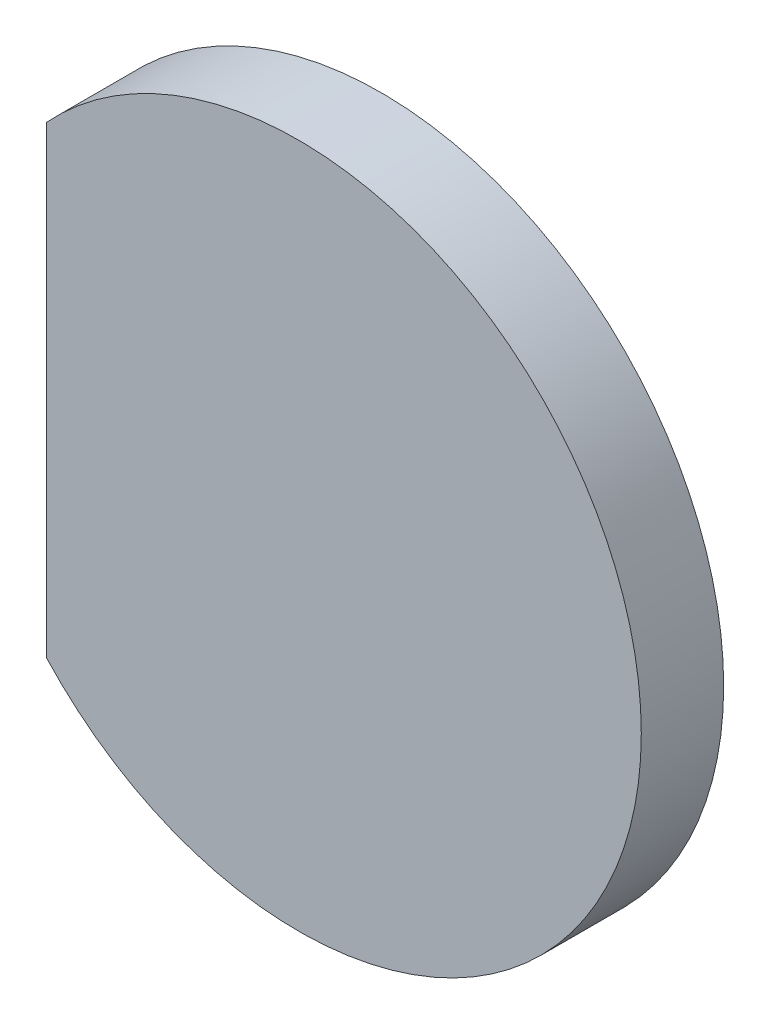
ISO-10303-21;
HEADER;
FILE_DESCRIPTION(('STEP AP214'),'2;1');
FILE_NAME('part.step','',(''),(''),'','','');
FILE_SCHEMA(('AUTOMOTIVE_DESIGN { 1 0 10303 214 1 1 1 1 }'));
ENDSEC;
DATA;
#1=APPLICATION_CONTEXT('core data for automotive mechanical design processes');
#2=APPLICATION_PROTOCOL_DEFINITION('international standard','automotive_design',2000,#1);
#3=PRODUCT_CONTEXT('',#1,'mechanical');
#4=PRODUCT('Part','Part','',(#3));
#5=PRODUCT_RELATED_PRODUCT_CATEGORY('part','',(#4));
#6=PRODUCT_DEFINITION_FORMATION('','',#4);
#7=PRODUCT_DEFINITION_CONTEXT('part definition',#1,'design');
#8=PRODUCT_DEFINITION('design','',#6,#7);
#9=PRODUCT_DEFINITION_SHAPE('','',#8);
#10=(LENGTH_UNIT() NAMED_UNIT(*) SI_UNIT(.MILLI.,.METRE.));
#11=(NAMED_UNIT(*) PLANE_ANGLE_UNIT() SI_UNIT($,.RADIAN.));
#12=(NAMED_UNIT(*) SI_UNIT($,.STERADIAN.) SOLID_ANGLE_UNIT());
#13=UNCERTAINTY_MEASURE_WITH_UNIT(LENGTH_MEASURE(1.E-05),#10,'distance_accuracy_value','');
#14=(GEOMETRIC_REPRESENTATION_CONTEXT(3) GLOBAL_UNCERTAINTY_ASSIGNED_CONTEXT((#13)) GLOBAL_UNIT_ASSIGNED_CONTEXT((#10,
#11,#12)) REPRESENTATION_CONTEXT('',''));
#15=CARTESIAN_POINT('',(0.,0.,0.));
#16=DIRECTION('',(0.,0.,1.));
#17=DIRECTION('',(1.,0.,0.));
#18=AXIS2_PLACEMENT_3D('',#15,#16,#17);
#19=CARTESIAN_POINT('',(0.,0.,14.017));
#20=DIRECTION('',(0.,0.,-1.));
#21=DIRECTION('',(-1.,0.,0.));
#22=AXIS2_PLACEMENT_3D('',#19,#20,#21);
#23=CYLINDRICAL_SURFACE('',#22,58.2854849648294);
#24=CARTESIAN_POINT('',(0.,0.,0.));
#25=DIRECTION('',(0.,0.,1.));
#26=DIRECTION('',(-1.,0.,0.));
#27=AXIS2_PLACEMENT_3D('',#24,#25,#26);
#28=CIRCLE('',#27,58.2854849648294);
#29=CARTESIAN_POINT('',(-42.9355150351706,-39.4175,0.));
#30=VERTEX_POINT('',#29);
#31=CARTESIAN_POINT('',(-42.9355150351706,39.4175,0.));
#32=VERTEX_POINT('',#31);
#33=EDGE_CURVE('E64',#30,#32,#28,.T.);
#34=ORIENTED_EDGE('',*,*,#33,.T.);
#35=DIRECTION('',(0.,0.,-1.));
#36=VECTOR('',#35,1.);
#37=CARTESIAN_POINT('',(-42.9355150351706,39.4175,14.017));
#38=LINE('',#37,#36);
#39=CARTESIAN_POINT('',(-42.9355150351706,39.4175,14.017));
#40=VERTEX_POINT('',#39);
#41=EDGE_CURVE('E11',#40,#32,#38,.T.);
#42=ORIENTED_EDGE('',*,*,#41,.F.);
#43=CARTESIAN_POINT('',(0.,0.,14.017));
#44=DIRECTION('',(0.,0.,1.));
#45=DIRECTION('',(-1.,0.,0.));
#46=AXIS2_PLACEMENT_3D('',#43,#44,#45);
#47=CIRCLE('',#46,58.2854849648294);
#48=CARTESIAN_POINT('',(-42.9355150351706,-39.4175,14.017));
#49=VERTEX_POINT('',#48);
#50=EDGE_CURVE('E63',#49,#40,#47,.T.);
#51=ORIENTED_EDGE('',*,*,#50,.F.);
#52=DIRECTION('',(0.,0.,-1.));
#53=VECTOR('',#52,1.);
#54=CARTESIAN_POINT('',(-42.9355150351706,-39.4175,14.017));
#55=LINE('',#54,#53);
#56=EDGE_CURVE('E41',#49,#30,#55,.T.);
#57=ORIENTED_EDGE('',*,*,#56,.T.);
#58=EDGE_LOOP('',(#34,#42,#51,#57));
#59=FACE_BOUND('',#58,.T.);
#60=ADVANCED_FACE('F33',(#59),#23,.T.);
#61=CARTESIAN_POINT('',(-42.9355150351706,39.4175,14.017));
#62=DIRECTION('',(1.,0.,0.));
#63=DIRECTION('',(0.,0.,-1.));
#64=AXIS2_PLACEMENT_3D('',#61,#62,#63);
#65=PLANE('',#64);
#66=DIRECTION('',(0.,-1.,0.));
#67=VECTOR('',#66,1.);
#68=CARTESIAN_POINT('',(-42.9355150351706,39.4175,0.));
#69=LINE('',#68,#67);
#70=EDGE_CURVE('E56',#32,#30,#69,.T.);
#71=ORIENTED_EDGE('',*,*,#70,.T.);
#72=ORIENTED_EDGE('',*,*,#56,.F.);
#73=DIRECTION('',(0.,-1.,0.));
#74=VECTOR('',#73,1.);
#75=CARTESIAN_POINT('',(-42.9355150351706,39.4175,14.017));
#76=LINE('',#75,#74);
#77=EDGE_CURVE('E48',#40,#49,#76,.T.);
#78=ORIENTED_EDGE('',*,*,#77,.F.);
#79=ORIENTED_EDGE('',*,*,#41,.T.);
#80=EDGE_LOOP('',(#71,#72,#78,#79));
#81=FACE_BOUND('',#80,.T.);
#82=ADVANCED_FACE('F59',(#81),#65,.F.);
#83=CARTESIAN_POINT('',(0.,0.,14.017));
#84=DIRECTION('',(0.,0.,-1.));
#85=DIRECTION('',(-1.,0.,0.));
#86=AXIS2_PLACEMENT_3D('',#83,#84,#85);
#87=PLANE('',#86);
#88=ORIENTED_EDGE('',*,*,#50,.T.);
#89=ORIENTED_EDGE('',*,*,#77,.T.);
#90=EDGE_LOOP('',(#88,#89));
#91=FACE_BOUND('',#90,.T.);
#92=ADVANCED_FACE('F71',(#91),#87,.F.);
#93=CARTESIAN_POINT('',(0.,0.,0.));
#94=DIRECTION('',(0.,0.,-1.));
#95=DIRECTION('',(-1.,0.,0.));
#96=AXIS2_PLACEMENT_3D('',#93,#94,#95);
#97=PLANE('',#96);
#98=ORIENTED_EDGE('',*,*,#33,.F.);
#99=ORIENTED_EDGE('',*,*,#70,.F.);
#100=EDGE_LOOP('',(#98,#99));
#101=FACE_BOUND('',#100,.T.);
#102=ADVANCED_FACE('F67',(#101),#97,.T.);
#103=CLOSED_SHELL('',(#60,#82,#92,#102));
#104=MANIFOLD_SOLID_BREP('B2',#103);
#105=ADVANCED_BREP_SHAPE_REPRESENTATION('',(#18,#104),#14);
#106=SHAPE_DEFINITION_REPRESENTATION(#9,#105);
ENDSEC;
END-ISO-10303-21;
